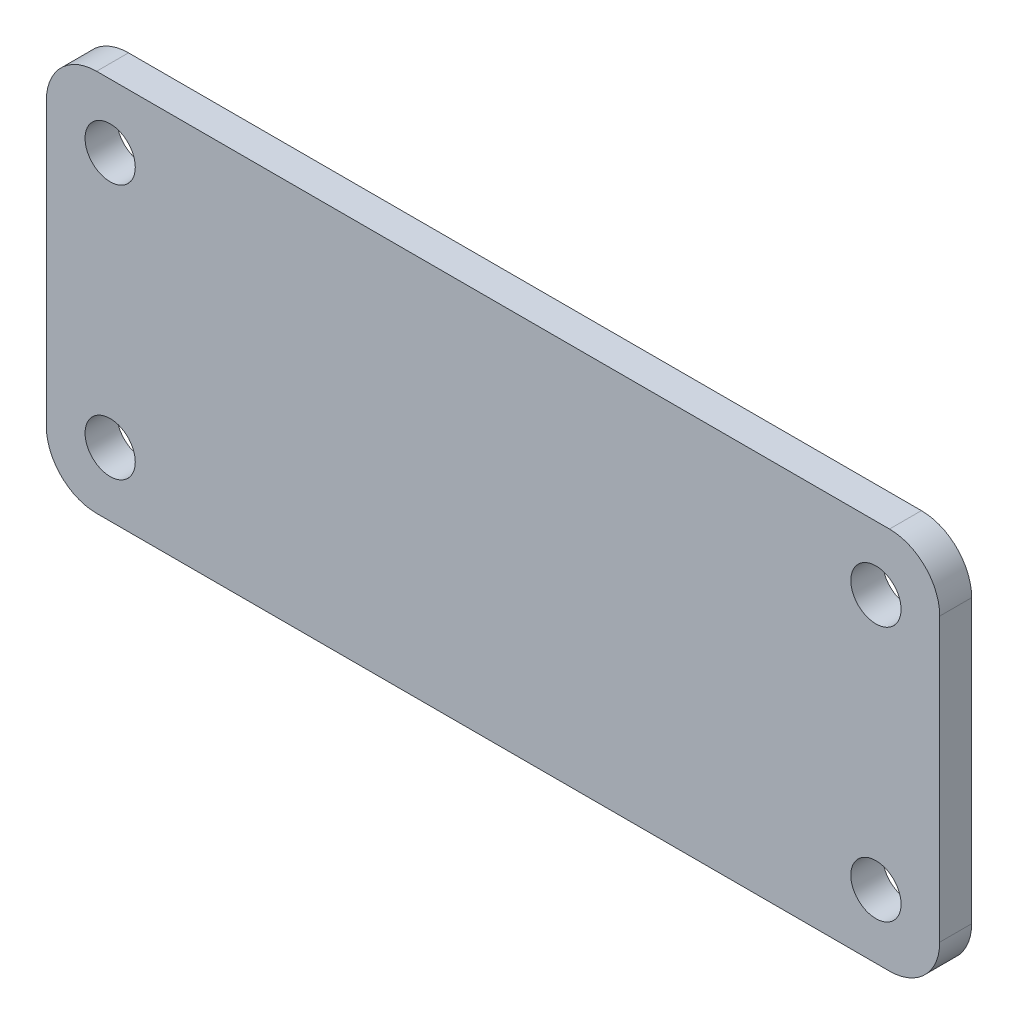
ISO-10303-21;
HEADER;
FILE_DESCRIPTION(('STEP AP214'),'2;1');
FILE_NAME('part.step','',(''),(''),'','','');
FILE_SCHEMA(('AUTOMOTIVE_DESIGN { 1 0 10303 214 1 1 1 1 }'));
ENDSEC;
DATA;
#1=APPLICATION_CONTEXT('core data for automotive mechanical design processes');
#2=APPLICATION_PROTOCOL_DEFINITION('international standard','automotive_design',2000,#1);
#3=PRODUCT_CONTEXT('',#1,'mechanical');
#4=PRODUCT('Part','Part','',(#3));
#5=PRODUCT_RELATED_PRODUCT_CATEGORY('part','',(#4));
#6=PRODUCT_DEFINITION_FORMATION('','',#4);
#7=PRODUCT_DEFINITION_CONTEXT('part definition',#1,'design');
#8=PRODUCT_DEFINITION('design','',#6,#7);
#9=PRODUCT_DEFINITION_SHAPE('','',#8);
#10=(LENGTH_UNIT() NAMED_UNIT(*) SI_UNIT(.MILLI.,.METRE.));
#11=(NAMED_UNIT(*) PLANE_ANGLE_UNIT() SI_UNIT($,.RADIAN.));
#12=(NAMED_UNIT(*) SI_UNIT($,.STERADIAN.) SOLID_ANGLE_UNIT());
#13=UNCERTAINTY_MEASURE_WITH_UNIT(LENGTH_MEASURE(1.E-05),#10,'distance_accuracy_value','');
#14=(GEOMETRIC_REPRESENTATION_CONTEXT(3) GLOBAL_UNCERTAINTY_ASSIGNED_CONTEXT((#13)) GLOBAL_UNIT_ASSIGNED_CONTEXT((#10,
#11,#12)) REPRESENTATION_CONTEXT('',''));
#15=CARTESIAN_POINT('',(0.,0.,0.));
#16=DIRECTION('',(0.,0.,1.));
#17=DIRECTION('',(1.,0.,0.));
#18=AXIS2_PLACEMENT_3D('',#15,#16,#17);
#19=CARTESIAN_POINT('',(5.,33.1,3.175));
#20=DIRECTION('',(0.,0.,-1.));
#21=DIRECTION('',(-1.,0.,0.));
#22=AXIS2_PLACEMENT_3D('',#19,#20,#21);
#23=PLANE('',#22);
#24=CARTESIAN_POINT('',(5.,33.1,3.175));
#25=DIRECTION('',(0.,0.,1.));
#26=DIRECTION('',(-1.,0.,0.));
#27=AXIS2_PLACEMENT_3D('',#24,#25,#26);
#28=CIRCLE('',#27,5.);
#29=CARTESIAN_POINT('',(5.,38.1,3.175));
#30=VERTEX_POINT('',#29);
#31=CARTESIAN_POINT('',(0.,33.1,3.175));
#32=VERTEX_POINT('',#31);
#33=EDGE_CURVE('E164',#30,#32,#28,.T.);
#34=ORIENTED_EDGE('',*,*,#33,.T.);
#35=DIRECTION('',(0.,-1.,0.));
#36=VECTOR('',#35,1.);
#37=CARTESIAN_POINT('',(0.,5.00000000000004,3.175));
#38=LINE('',#37,#36);
#39=CARTESIAN_POINT('',(0.,5.00000000000004,3.175));
#40=VERTEX_POINT('',#39);
#41=EDGE_CURVE('E100',#32,#40,#38,.T.);
#42=ORIENTED_EDGE('',*,*,#41,.T.);
#43=CARTESIAN_POINT('',(5.,5.,3.175));
#44=DIRECTION('',(0.,0.,1.));
#45=DIRECTION('',(-1.,0.,0.));
#46=AXIS2_PLACEMENT_3D('',#43,#44,#45);
#47=CIRCLE('',#46,5.);
#48=CARTESIAN_POINT('',(5.00000000000004,0.,3.175));
#49=VERTEX_POINT('',#48);
#50=EDGE_CURVE('E185',#40,#49,#47,.T.);
#51=ORIENTED_EDGE('',*,*,#50,.T.);
#52=DIRECTION('',(1.,0.,0.));
#53=VECTOR('',#52,1.);
#54=CARTESIAN_POINT('',(5.00000000000004,0.,3.175));
#55=LINE('',#54,#53);
#56=CARTESIAN_POINT('',(83.9,0.,3.175));
#57=VERTEX_POINT('',#56);
#58=EDGE_CURVE('E199',#49,#57,#55,.T.);
#59=ORIENTED_EDGE('',*,*,#58,.T.);
#60=CARTESIAN_POINT('',(83.9,5.,3.175));
#61=DIRECTION('',(0.,0.,1.));
#62=DIRECTION('',(1.,0.,0.));
#63=AXIS2_PLACEMENT_3D('',#60,#61,#62);
#64=CIRCLE('',#63,5.);
#65=CARTESIAN_POINT('',(88.9,5.,3.175));
#66=VERTEX_POINT('',#65);
#67=EDGE_CURVE('E119',#57,#66,#64,.T.);
#68=ORIENTED_EDGE('',*,*,#67,.T.);
#69=DIRECTION('',(0.,1.,0.));
#70=VECTOR('',#69,1.);
#71=CARTESIAN_POINT('',(88.9,5.00000000000004,3.175));
#72=LINE('',#71,#70);
#73=CARTESIAN_POINT('',(88.9,33.1,3.175));
#74=VERTEX_POINT('',#73);
#75=EDGE_CURVE('E113',#66,#74,#72,.T.);
#76=ORIENTED_EDGE('',*,*,#75,.T.);
#77=CARTESIAN_POINT('',(83.9,33.1,3.175));
#78=DIRECTION('',(0.,0.,1.));
#79=DIRECTION('',(1.,0.,0.));
#80=AXIS2_PLACEMENT_3D('',#77,#78,#79);
#81=CIRCLE('',#80,5.);
#82=CARTESIAN_POINT('',(83.9,38.1,3.175));
#83=VERTEX_POINT('',#82);
#84=EDGE_CURVE('E117',#74,#83,#81,.T.);
#85=ORIENTED_EDGE('',*,*,#84,.T.);
#86=DIRECTION('',(-1.,0.,0.));
#87=VECTOR('',#86,1.);
#88=CARTESIAN_POINT('',(5.,38.1,3.175));
#89=LINE('',#88,#87);
#90=EDGE_CURVE('E57',#83,#30,#89,.T.);
#91=ORIENTED_EDGE('',*,*,#90,.T.);
#92=EDGE_LOOP('',(#34,#42,#51,#59,#68,#76,#85,#91));
#93=FACE_BOUND('',#92,.T.);
#94=CARTESIAN_POINT('',(6.35,31.75,3.175));
#95=DIRECTION('',(0.,0.,1.));
#96=DIRECTION('',(1.,0.,0.));
#97=AXIS2_PLACEMENT_3D('',#94,#95,#96);
#98=CIRCLE('',#97,2.5);
#99=CARTESIAN_POINT('',(8.85,31.75,3.175));
#100=VERTEX_POINT('',#99);
#101=EDGE_CURVE('E146',#100,#100,#98,.T.);
#102=ORIENTED_EDGE('',*,*,#101,.F.);
#103=EDGE_LOOP('',(#102));
#104=FACE_BOUND('',#103,.T.);
#105=CARTESIAN_POINT('',(82.55,31.75,3.175));
#106=DIRECTION('',(0.,0.,1.));
#107=DIRECTION('',(1.,0.,0.));
#108=AXIS2_PLACEMENT_3D('',#105,#106,#107);
#109=CIRCLE('',#108,2.50000000000001);
#110=CARTESIAN_POINT('',(85.05,31.75,3.175));
#111=VERTEX_POINT('',#110);
#112=EDGE_CURVE('E213',#111,#111,#109,.T.);
#113=ORIENTED_EDGE('',*,*,#112,.F.);
#114=EDGE_LOOP('',(#113));
#115=FACE_BOUND('',#114,.T.);
#116=CARTESIAN_POINT('',(82.5500000000006,6.35,3.175));
#117=DIRECTION('',(0.,0.,1.));
#118=DIRECTION('',(1.,0.,0.));
#119=AXIS2_PLACEMENT_3D('',#116,#117,#118);
#120=CIRCLE('',#119,2.50000000000001);
#121=CARTESIAN_POINT('',(85.0500000000006,6.35,3.175));
#122=VERTEX_POINT('',#121);
#123=EDGE_CURVE('E221',#122,#122,#120,.T.);
#124=ORIENTED_EDGE('',*,*,#123,.F.);
#125=EDGE_LOOP('',(#124));
#126=FACE_BOUND('',#125,.T.);
#127=CARTESIAN_POINT('',(6.35000000000062,6.35,3.175));
#128=DIRECTION('',(0.,0.,1.));
#129=DIRECTION('',(1.,0.,0.));
#130=AXIS2_PLACEMENT_3D('',#127,#128,#129);
#131=CIRCLE('',#130,2.5);
#132=CARTESIAN_POINT('',(8.85000000000063,6.35,3.175));
#133=VERTEX_POINT('',#132);
#134=EDGE_CURVE('E229',#133,#133,#131,.T.);
#135=ORIENTED_EDGE('',*,*,#134,.F.);
#136=EDGE_LOOP('',(#135));
#137=FACE_BOUND('',#136,.T.);
#138=ADVANCED_FACE('F39',(#93,#104,#115,#126,#137),#23,.F.);
#139=CARTESIAN_POINT('',(5.,33.1,0.));
#140=DIRECTION('',(0.,0.,-1.));
#141=DIRECTION('',(-1.,0.,0.));
#142=AXIS2_PLACEMENT_3D('',#139,#140,#141);
#143=PLANE('',#142);
#144=CARTESIAN_POINT('',(82.5500000000006,6.35,0.));
#145=DIRECTION('',(0.,0.,1.));
#146=DIRECTION('',(1.,0.,0.));
#147=AXIS2_PLACEMENT_3D('',#144,#145,#146);
#148=CIRCLE('',#147,2.50000000000001);
#149=CARTESIAN_POINT('',(85.0500000000006,6.35,0.));
#150=VERTEX_POINT('',#149);
#151=EDGE_CURVE('E225',#150,#150,#148,.T.);
#152=ORIENTED_EDGE('',*,*,#151,.T.);
#153=EDGE_LOOP('',(#152));
#154=FACE_BOUND('',#153,.T.);
#155=CARTESIAN_POINT('',(6.35,31.75,0.));
#156=DIRECTION('',(0.,0.,1.));
#157=DIRECTION('',(1.,0.,0.));
#158=AXIS2_PLACEMENT_3D('',#155,#156,#157);
#159=CIRCLE('',#158,2.5);
#160=CARTESIAN_POINT('',(8.85,31.75,0.));
#161=VERTEX_POINT('',#160);
#162=EDGE_CURVE('E209',#161,#161,#159,.T.);
#163=ORIENTED_EDGE('',*,*,#162,.T.);
#164=EDGE_LOOP('',(#163));
#165=FACE_BOUND('',#164,.T.);
#166=CARTESIAN_POINT('',(5.,33.1,0.));
#167=DIRECTION('',(0.,0.,1.));
#168=DIRECTION('',(-1.,0.,0.));
#169=AXIS2_PLACEMENT_3D('',#166,#167,#168);
#170=CIRCLE('',#169,5.);
#171=CARTESIAN_POINT('',(5.,38.1,0.));
#172=VERTEX_POINT('',#171);
#173=CARTESIAN_POINT('',(0.,33.1,0.));
#174=VERTEX_POINT('',#173);
#175=EDGE_CURVE('E141',#172,#174,#170,.T.);
#176=ORIENTED_EDGE('',*,*,#175,.F.);
#177=DIRECTION('',(-1.,0.,0.));
#178=VECTOR('',#177,1.);
#179=CARTESIAN_POINT('',(5.,38.1,0.));
#180=LINE('',#179,#178);
#181=CARTESIAN_POINT('',(83.9,38.1,0.));
#182=VERTEX_POINT('',#181);
#183=EDGE_CURVE('E92',#182,#172,#180,.T.);
#184=ORIENTED_EDGE('',*,*,#183,.F.);
#185=CARTESIAN_POINT('',(83.9,33.1,0.));
#186=DIRECTION('',(0.,0.,1.));
#187=DIRECTION('',(1.,0.,0.));
#188=AXIS2_PLACEMENT_3D('',#185,#186,#187);
#189=CIRCLE('',#188,5.);
#190=CARTESIAN_POINT('',(88.9,33.1,0.));
#191=VERTEX_POINT('',#190);
#192=EDGE_CURVE('E86',#191,#182,#189,.T.);
#193=ORIENTED_EDGE('',*,*,#192,.F.);
#194=DIRECTION('',(0.,1.,0.));
#195=VECTOR('',#194,1.);
#196=CARTESIAN_POINT('',(88.9,5.00000000000004,0.));
#197=LINE('',#196,#195);
#198=CARTESIAN_POINT('',(88.9,5.,0.));
#199=VERTEX_POINT('',#198);
#200=EDGE_CURVE('E128',#199,#191,#197,.T.);
#201=ORIENTED_EDGE('',*,*,#200,.F.);
#202=CARTESIAN_POINT('',(83.9,5.,0.));
#203=DIRECTION('',(0.,0.,1.));
#204=DIRECTION('',(1.,0.,0.));
#205=AXIS2_PLACEMENT_3D('',#202,#203,#204);
#206=CIRCLE('',#205,5.);
#207=CARTESIAN_POINT('',(83.9,0.,0.));
#208=VERTEX_POINT('',#207);
#209=EDGE_CURVE('E155',#208,#199,#206,.T.);
#210=ORIENTED_EDGE('',*,*,#209,.F.);
#211=DIRECTION('',(1.,0.,0.));
#212=VECTOR('',#211,1.);
#213=CARTESIAN_POINT('',(5.00000000000004,0.,0.));
#214=LINE('',#213,#212);
#215=CARTESIAN_POINT('',(5.00000000000004,0.,0.));
#216=VERTEX_POINT('',#215);
#217=EDGE_CURVE('E152',#216,#208,#214,.T.);
#218=ORIENTED_EDGE('',*,*,#217,.F.);
#219=CARTESIAN_POINT('',(5.,5.,0.));
#220=DIRECTION('',(0.,0.,1.));
#221=DIRECTION('',(-1.,0.,0.));
#222=AXIS2_PLACEMENT_3D('',#219,#220,#221);
#223=CIRCLE('',#222,5.);
#224=CARTESIAN_POINT('',(0.,5.00000000000004,0.));
#225=VERTEX_POINT('',#224);
#226=EDGE_CURVE('E149',#225,#216,#223,.T.);
#227=ORIENTED_EDGE('',*,*,#226,.F.);
#228=DIRECTION('',(0.,-1.,0.));
#229=VECTOR('',#228,1.);
#230=CARTESIAN_POINT('',(0.,5.00000000000004,0.));
#231=LINE('',#230,#229);
#232=EDGE_CURVE('E145',#174,#225,#231,.T.);
#233=ORIENTED_EDGE('',*,*,#232,.F.);
#234=EDGE_LOOP('',(#176,#184,#193,#201,#210,#218,#227,#233));
#235=FACE_BOUND('',#234,.T.);
#236=CARTESIAN_POINT('',(82.55,31.75,0.));
#237=DIRECTION('',(0.,0.,1.));
#238=DIRECTION('',(1.,0.,0.));
#239=AXIS2_PLACEMENT_3D('',#236,#237,#238);
#240=CIRCLE('',#239,2.50000000000001);
#241=CARTESIAN_POINT('',(85.05,31.75,0.));
#242=VERTEX_POINT('',#241);
#243=EDGE_CURVE('E217',#242,#242,#240,.T.);
#244=ORIENTED_EDGE('',*,*,#243,.T.);
#245=EDGE_LOOP('',(#244));
#246=FACE_BOUND('',#245,.T.);
#247=CARTESIAN_POINT('',(6.35000000000062,6.35,0.));
#248=DIRECTION('',(0.,0.,1.));
#249=DIRECTION('',(1.,0.,0.));
#250=AXIS2_PLACEMENT_3D('',#247,#248,#249);
#251=CIRCLE('',#250,2.5);
#252=CARTESIAN_POINT('',(8.85000000000063,6.35,0.));
#253=VERTEX_POINT('',#252);
#254=EDGE_CURVE('E233',#253,#253,#251,.T.);
#255=ORIENTED_EDGE('',*,*,#254,.T.);
#256=EDGE_LOOP('',(#255));
#257=FACE_BOUND('',#256,.T.);
#258=ADVANCED_FACE('F189',(#154,#165,#235,#246,#257),#143,.T.);
#259=CARTESIAN_POINT('',(5.,33.1,3.175));
#260=DIRECTION('',(0.,0.,-1.));
#261=DIRECTION('',(-1.,0.,0.));
#262=AXIS2_PLACEMENT_3D('',#259,#260,#261);
#263=CYLINDRICAL_SURFACE('',#262,5.);
#264=ORIENTED_EDGE('',*,*,#175,.T.);
#265=DIRECTION('',(0.,0.,-1.));
#266=VECTOR('',#265,1.);
#267=CARTESIAN_POINT('',(0.,33.1,3.175));
#268=LINE('',#267,#266);
#269=EDGE_CURVE('E11',#32,#174,#268,.T.);
#270=ORIENTED_EDGE('',*,*,#269,.F.);
#271=ORIENTED_EDGE('',*,*,#33,.F.);
#272=DIRECTION('',(0.,0.,-1.));
#273=VECTOR('',#272,1.);
#274=CARTESIAN_POINT('',(5.,38.1,3.175));
#275=LINE('',#274,#273);
#276=EDGE_CURVE('E137',#30,#172,#275,.T.);
#277=ORIENTED_EDGE('',*,*,#276,.T.);
#278=EDGE_LOOP('',(#264,#270,#271,#277));
#279=FACE_BOUND('',#278,.T.);
#280=ADVANCED_FACE('F41',(#279),#263,.T.);
#281=CARTESIAN_POINT('',(0.,5.00000000000004,3.175));
#282=DIRECTION('',(1.,0.,0.));
#283=DIRECTION('',(0.,0.,-1.));
#284=AXIS2_PLACEMENT_3D('',#281,#282,#283);
#285=PLANE('',#284);
#286=ORIENTED_EDGE('',*,*,#232,.T.);
#287=DIRECTION('',(0.,0.,-1.));
#288=VECTOR('',#287,1.);
#289=CARTESIAN_POINT('',(0.,5.00000000000004,3.175));
#290=LINE('',#289,#288);
#291=EDGE_CURVE('E49',#40,#225,#290,.T.);
#292=ORIENTED_EDGE('',*,*,#291,.F.);
#293=ORIENTED_EDGE('',*,*,#41,.F.);
#294=ORIENTED_EDGE('',*,*,#269,.T.);
#295=EDGE_LOOP('',(#286,#292,#293,#294));
#296=FACE_BOUND('',#295,.T.);
#297=ADVANCED_FACE('F267',(#296),#285,.F.);
#298=CARTESIAN_POINT('',(5.,5.,3.175));
#299=DIRECTION('',(0.,0.,-1.));
#300=DIRECTION('',(-1.,0.,0.));
#301=AXIS2_PLACEMENT_3D('',#298,#299,#300);
#302=CYLINDRICAL_SURFACE('',#301,5.);
#303=ORIENTED_EDGE('',*,*,#226,.T.);
#304=DIRECTION('',(0.,0.,-1.));
#305=VECTOR('',#304,1.);
#306=CARTESIAN_POINT('',(5.00000000000004,0.,3.175));
#307=LINE('',#306,#305);
#308=EDGE_CURVE('E175',#49,#216,#307,.T.);
#309=ORIENTED_EDGE('',*,*,#308,.F.);
#310=ORIENTED_EDGE('',*,*,#50,.F.);
#311=ORIENTED_EDGE('',*,*,#291,.T.);
#312=EDGE_LOOP('',(#303,#309,#310,#311));
#313=FACE_BOUND('',#312,.T.);
#314=ADVANCED_FACE('F183',(#313),#302,.T.);
#315=CARTESIAN_POINT('',(5.00000000000004,0.,3.175));
#316=DIRECTION('',(0.,1.,0.));
#317=DIRECTION('',(0.,0.,1.));
#318=AXIS2_PLACEMENT_3D('',#315,#316,#317);
#319=PLANE('',#318);
#320=ORIENTED_EDGE('',*,*,#217,.T.);
#321=DIRECTION('',(0.,0.,-1.));
#322=VECTOR('',#321,1.);
#323=CARTESIAN_POINT('',(83.9,0.,3.175));
#324=LINE('',#323,#322);
#325=EDGE_CURVE('E171',#57,#208,#324,.T.);
#326=ORIENTED_EDGE('',*,*,#325,.F.);
#327=ORIENTED_EDGE('',*,*,#58,.F.);
#328=ORIENTED_EDGE('',*,*,#308,.T.);
#329=EDGE_LOOP('',(#320,#326,#327,#328));
#330=FACE_BOUND('',#329,.T.);
#331=ADVANCED_FACE('F194',(#330),#319,.F.);
#332=CARTESIAN_POINT('',(83.9,5.,3.175));
#333=DIRECTION('',(0.,0.,-1.));
#334=DIRECTION('',(-1.,0.,0.));
#335=AXIS2_PLACEMENT_3D('',#332,#333,#334);
#336=CYLINDRICAL_SURFACE('',#335,5.);
#337=ORIENTED_EDGE('',*,*,#209,.T.);
#338=DIRECTION('',(0.,0.,-1.));
#339=VECTOR('',#338,1.);
#340=CARTESIAN_POINT('',(88.9,5.,3.175));
#341=LINE('',#340,#339);
#342=EDGE_CURVE('E130',#66,#199,#341,.T.);
#343=ORIENTED_EDGE('',*,*,#342,.F.);
#344=ORIENTED_EDGE('',*,*,#67,.F.);
#345=ORIENTED_EDGE('',*,*,#325,.T.);
#346=EDGE_LOOP('',(#337,#343,#344,#345));
#347=FACE_BOUND('',#346,.T.);
#348=ADVANCED_FACE('F197',(#347),#336,.T.);
#349=CARTESIAN_POINT('',(88.9,5.00000000000004,3.175));
#350=DIRECTION('',(-1.,0.,0.));
#351=DIRECTION('',(0.,0.,1.));
#352=AXIS2_PLACEMENT_3D('',#349,#350,#351);
#353=PLANE('',#352);
#354=ORIENTED_EDGE('',*,*,#200,.T.);
#355=DIRECTION('',(0.,0.,-1.));
#356=VECTOR('',#355,1.);
#357=CARTESIAN_POINT('',(88.9,33.1,3.175));
#358=LINE('',#357,#356);
#359=EDGE_CURVE('E125',#74,#191,#358,.T.);
#360=ORIENTED_EDGE('',*,*,#359,.F.);
#361=ORIENTED_EDGE('',*,*,#75,.F.);
#362=ORIENTED_EDGE('',*,*,#342,.T.);
#363=EDGE_LOOP('',(#354,#360,#361,#362));
#364=FACE_BOUND('',#363,.T.);
#365=ADVANCED_FACE('F126',(#364),#353,.F.);
#366=CARTESIAN_POINT('',(83.9,33.1,3.175));
#367=DIRECTION('',(0.,0.,-1.));
#368=DIRECTION('',(-1.,0.,0.));
#369=AXIS2_PLACEMENT_3D('',#366,#367,#368);
#370=CYLINDRICAL_SURFACE('',#369,5.);
#371=ORIENTED_EDGE('',*,*,#192,.T.);
#372=DIRECTION('',(0.,0.,-1.));
#373=VECTOR('',#372,1.);
#374=CARTESIAN_POINT('',(83.9,38.1,3.175));
#375=LINE('',#374,#373);
#376=EDGE_CURVE('E131',#83,#182,#375,.T.);
#377=ORIENTED_EDGE('',*,*,#376,.F.);
#378=ORIENTED_EDGE('',*,*,#84,.F.);
#379=ORIENTED_EDGE('',*,*,#359,.T.);
#380=EDGE_LOOP('',(#371,#377,#378,#379));
#381=FACE_BOUND('',#380,.T.);
#382=ADVANCED_FACE('F133',(#381),#370,.T.);
#383=CARTESIAN_POINT('',(5.,38.1,3.175));
#384=DIRECTION('',(0.,-1.,0.));
#385=DIRECTION('',(0.,0.,-1.));
#386=AXIS2_PLACEMENT_3D('',#383,#384,#385);
#387=PLANE('',#386);
#388=ORIENTED_EDGE('',*,*,#183,.T.);
#389=ORIENTED_EDGE('',*,*,#276,.F.);
#390=ORIENTED_EDGE('',*,*,#90,.F.);
#391=ORIENTED_EDGE('',*,*,#376,.T.);
#392=EDGE_LOOP('',(#388,#389,#390,#391));
#393=FACE_BOUND('',#392,.T.);
#394=ADVANCED_FACE('F255',(#393),#387,.F.);
#395=CARTESIAN_POINT('',(6.35,31.75,3.175));
#396=DIRECTION('',(0.,0.,-1.));
#397=DIRECTION('',(-1.,0.,0.));
#398=AXIS2_PLACEMENT_3D('',#395,#396,#397);
#399=CYLINDRICAL_SURFACE('',#398,2.5);
#400=ORIENTED_EDGE('',*,*,#101,.T.);
#401=EDGE_LOOP('',(#400));
#402=FACE_BOUND('',#401,.T.);
#403=ORIENTED_EDGE('',*,*,#162,.F.);
#404=EDGE_LOOP('',(#403));
#405=FACE_BOUND('',#404,.T.);
#406=ADVANCED_FACE('F252',(#402,#405),#399,.F.);
#407=CARTESIAN_POINT('',(82.55,31.75,3.175));
#408=DIRECTION('',(0.,0.,-1.));
#409=DIRECTION('',(-1.,0.,0.));
#410=AXIS2_PLACEMENT_3D('',#407,#408,#409);
#411=CYLINDRICAL_SURFACE('',#410,2.50000000000001);
#412=ORIENTED_EDGE('',*,*,#112,.T.);
#413=EDGE_LOOP('',(#412));
#414=FACE_BOUND('',#413,.T.);
#415=ORIENTED_EDGE('',*,*,#243,.F.);
#416=EDGE_LOOP('',(#415));
#417=FACE_BOUND('',#416,.T.);
#418=ADVANCED_FACE('F331',(#414,#417),#411,.F.);
#419=CARTESIAN_POINT('',(82.5500000000006,6.35,3.175));
#420=DIRECTION('',(0.,0.,-1.));
#421=DIRECTION('',(-1.,0.,0.));
#422=AXIS2_PLACEMENT_3D('',#419,#420,#421);
#423=CYLINDRICAL_SURFACE('',#422,2.50000000000001);
#424=ORIENTED_EDGE('',*,*,#123,.T.);
#425=EDGE_LOOP('',(#424));
#426=FACE_BOUND('',#425,.T.);
#427=ORIENTED_EDGE('',*,*,#151,.F.);
#428=EDGE_LOOP('',(#427));
#429=FACE_BOUND('',#428,.T.);
#430=ADVANCED_FACE('F339',(#426,#429),#423,.F.);
#431=CARTESIAN_POINT('',(6.35000000000062,6.35,3.175));
#432=DIRECTION('',(0.,0.,-1.));
#433=DIRECTION('',(-1.,0.,0.));
#434=AXIS2_PLACEMENT_3D('',#431,#432,#433);
#435=CYLINDRICAL_SURFACE('',#434,2.5);
#436=ORIENTED_EDGE('',*,*,#134,.T.);
#437=EDGE_LOOP('',(#436));
#438=FACE_BOUND('',#437,.T.);
#439=ORIENTED_EDGE('',*,*,#254,.F.);
#440=EDGE_LOOP('',(#439));
#441=FACE_BOUND('',#440,.T.);
#442=ADVANCED_FACE('F241',(#438,#441),#435,.F.);
#443=CLOSED_SHELL('',(#138,#258,#280,#297,#314,#331,#348,#365,#382,#394,#406,#418,#430,#442));
#444=MANIFOLD_SOLID_BREP('B2',#443);
#445=ADVANCED_BREP_SHAPE_REPRESENTATION('',(#18,#444),#14);
#446=SHAPE_DEFINITION_REPRESENTATION(#9,#445);
ENDSEC;
END-ISO-10303-21;
